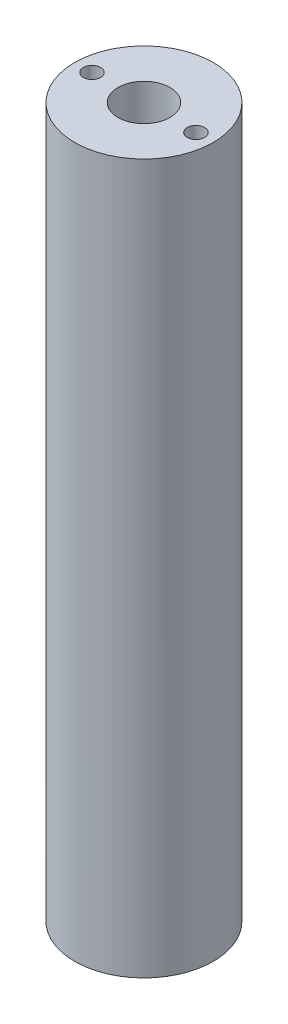
ISO-10303-21;
HEADER;
FILE_DESCRIPTION(('STEP AP214'),'2;1');
FILE_NAME('part.step','',(''),(''),'','','');
FILE_SCHEMA(('AUTOMOTIVE_DESIGN { 1 0 10303 214 1 1 1 1 }'));
ENDSEC;
DATA;
#1=APPLICATION_CONTEXT('core data for automotive mechanical design processes');
#2=APPLICATION_PROTOCOL_DEFINITION('international standard','automotive_design',2000,#1);
#3=PRODUCT_CONTEXT('',#1,'mechanical');
#4=PRODUCT('Part','Part','',(#3));
#5=PRODUCT_RELATED_PRODUCT_CATEGORY('part','',(#4));
#6=PRODUCT_DEFINITION_FORMATION('','',#4);
#7=PRODUCT_DEFINITION_CONTEXT('part definition',#1,'design');
#8=PRODUCT_DEFINITION('design','',#6,#7);
#9=PRODUCT_DEFINITION_SHAPE('','',#8);
#10=(LENGTH_UNIT() NAMED_UNIT(*) SI_UNIT(.MILLI.,.METRE.));
#11=(NAMED_UNIT(*) PLANE_ANGLE_UNIT() SI_UNIT($,.RADIAN.));
#12=(NAMED_UNIT(*) SI_UNIT($,.STERADIAN.) SOLID_ANGLE_UNIT());
#13=UNCERTAINTY_MEASURE_WITH_UNIT(LENGTH_MEASURE(1.E-05),#10,'distance_accuracy_value','');
#14=(GEOMETRIC_REPRESENTATION_CONTEXT(3) GLOBAL_UNCERTAINTY_ASSIGNED_CONTEXT((#13)) GLOBAL_UNIT_ASSIGNED_CONTEXT((#10,
#11,#12)) REPRESENTATION_CONTEXT('',''));
#15=CARTESIAN_POINT('',(0.,0.,0.));
#16=DIRECTION('',(0.,0.,1.));
#17=DIRECTION('',(1.,0.,0.));
#18=AXIS2_PLACEMENT_3D('',#15,#16,#17);
#19=CARTESIAN_POINT('',(101.306111270541,318.427183999586,0.));
#20=DIRECTION('',(0.,1.,0.));
#21=DIRECTION('',(-1.,0.,0.));
#22=AXIS2_PLACEMENT_3D('',#19,#20,#21);
#23=CYLINDRICAL_SURFACE('',#22,12.7);
#24=CARTESIAN_POINT('',(101.306111270541,188.458114983757,0.));
#25=DIRECTION('',(0.,-1.,0.));
#26=DIRECTION('',(0.,0.,-1.));
#27=AXIS2_PLACEMENT_3D('',#24,#25,#26);
#28=CIRCLE('',#27,12.7);
#29=CARTESIAN_POINT('',(101.306111270541,188.458114983757,-12.7));
#30=VERTEX_POINT('',#29);
#31=EDGE_CURVE('E42',#30,#30,#28,.F.);
#32=ORIENTED_EDGE('',*,*,#31,.F.);
#33=EDGE_LOOP('',(#32));
#34=FACE_BOUND('',#33,.T.);
#35=CARTESIAN_POINT('',(101.306111270541,58.4890459679269,0.));
#36=DIRECTION('',(0.,1.,0.));
#37=DIRECTION('',(-1.,0.,0.));
#38=AXIS2_PLACEMENT_3D('',#35,#36,#37);
#39=CIRCLE('',#38,12.7);
#40=CARTESIAN_POINT('',(88.6061112705412,58.4890459679269,0.));
#41=VERTEX_POINT('',#40);
#42=EDGE_CURVE('E10',#41,#41,#39,.T.);
#43=ORIENTED_EDGE('',*,*,#42,.T.);
#44=EDGE_LOOP('',(#43));
#45=FACE_BOUND('',#44,.T.);
#46=ADVANCED_FACE('F31',(#34,#45),#23,.T.);
#47=CARTESIAN_POINT('',(88.6061112705412,58.4890459679269,0.));
#48=DIRECTION('',(0.,-1.,0.));
#49=DIRECTION('',(1.,0.,0.));
#50=AXIS2_PLACEMENT_3D('',#47,#48,#49);
#51=PLANE('',#50);
#52=CARTESIAN_POINT('',(110.831111270541,58.4890459679269,0.));
#53=DIRECTION('',(0.,-1.,0.));
#54=DIRECTION('',(1.,0.,0.));
#55=AXIS2_PLACEMENT_3D('',#52,#53,#54);
#56=CIRCLE('',#55,1.5875);
#57=CARTESIAN_POINT('',(112.418611270541,58.4890459679269,0.));
#58=VERTEX_POINT('',#57);
#59=EDGE_CURVE('E66',#58,#58,#56,.T.);
#60=ORIENTED_EDGE('',*,*,#59,.F.);
#61=EDGE_LOOP('',(#60));
#62=FACE_BOUND('',#61,.T.);
#63=CARTESIAN_POINT('',(91.7811112705412,58.4890459679269,0.));
#64=DIRECTION('',(0.,-1.,0.));
#65=DIRECTION('',(1.,0.,0.));
#66=AXIS2_PLACEMENT_3D('',#63,#64,#65);
#67=CIRCLE('',#66,1.5875);
#68=CARTESIAN_POINT('',(93.3686112705413,58.4890459679269,0.));
#69=VERTEX_POINT('',#68);
#70=EDGE_CURVE('E60',#69,#69,#67,.T.);
#71=ORIENTED_EDGE('',*,*,#70,.F.);
#72=EDGE_LOOP('',(#71));
#73=FACE_BOUND('',#72,.T.);
#74=CARTESIAN_POINT('',(101.306111270541,58.4890459679269,0.));
#75=DIRECTION('',(0.,1.,0.));
#76=DIRECTION('',(-1.,0.,0.));
#77=AXIS2_PLACEMENT_3D('',#74,#75,#76);
#78=CIRCLE('',#77,4.7625);
#79=CARTESIAN_POINT('',(96.5436112705412,58.4890459679269,0.));
#80=VERTEX_POINT('',#79);
#81=EDGE_CURVE('E38',#80,#80,#78,.T.);
#82=ORIENTED_EDGE('',*,*,#81,.T.);
#83=EDGE_LOOP('',(#82));
#84=FACE_BOUND('',#83,.T.);
#85=ORIENTED_EDGE('',*,*,#42,.F.);
#86=EDGE_LOOP('',(#85));
#87=FACE_BOUND('',#86,.T.);
#88=ADVANCED_FACE('F81',(#62,#73,#84,#87),#51,.T.);
#89=CARTESIAN_POINT('',(101.306111270541,58.4890459679269,0.));
#90=DIRECTION('',(0.,1.,0.));
#91=DIRECTION('',(-1.,0.,0.));
#92=AXIS2_PLACEMENT_3D('',#89,#90,#91);
#93=CYLINDRICAL_SURFACE('',#92,4.7625);
#94=CARTESIAN_POINT('',(101.306111270541,188.458114983757,0.));
#95=DIRECTION('',(0.,-1.,0.));
#96=DIRECTION('',(0.,0.,-1.));
#97=AXIS2_PLACEMENT_3D('',#94,#95,#96);
#98=CIRCLE('',#97,4.7625);
#99=CARTESIAN_POINT('',(101.306111270541,188.458114983757,-4.7625));
#100=VERTEX_POINT('',#99);
#101=EDGE_CURVE('E34',#100,#100,#98,.F.);
#102=ORIENTED_EDGE('',*,*,#101,.T.);
#103=EDGE_LOOP('',(#102));
#104=FACE_BOUND('',#103,.T.);
#105=ORIENTED_EDGE('',*,*,#81,.F.);
#106=EDGE_LOOP('',(#105));
#107=FACE_BOUND('',#106,.T.);
#108=ADVANCED_FACE('F84',(#104,#107),#93,.F.);
#109=CARTESIAN_POINT('',(52.6227381384911,188.458114983757,-12.7));
#110=DIRECTION('',(0.,-1.,0.));
#111=DIRECTION('',(0.,0.,-1.));
#112=AXIS2_PLACEMENT_3D('',#109,#110,#111);
#113=PLANE('',#112);
#114=CARTESIAN_POINT('',(110.831111270541,188.458114983757,0.));
#115=DIRECTION('',(0.,1.,0.));
#116=DIRECTION('',(0.,0.,1.));
#117=AXIS2_PLACEMENT_3D('',#114,#115,#116);
#118=CIRCLE('',#117,1.5875);
#119=CARTESIAN_POINT('',(110.831111270541,188.458114983757,1.5875));
#120=VERTEX_POINT('',#119);
#121=EDGE_CURVE('E54',#120,#120,#118,.T.);
#122=ORIENTED_EDGE('',*,*,#121,.F.);
#123=EDGE_LOOP('',(#122));
#124=FACE_BOUND('',#123,.T.);
#125=CARTESIAN_POINT('',(91.7811112705412,188.458114983757,0.));
#126=DIRECTION('',(0.,1.,0.));
#127=DIRECTION('',(0.,0.,1.));
#128=AXIS2_PLACEMENT_3D('',#125,#126,#127);
#129=CIRCLE('',#128,1.5875);
#130=CARTESIAN_POINT('',(91.7811112705412,188.458114983757,1.5875));
#131=VERTEX_POINT('',#130);
#132=EDGE_CURVE('E47',#131,#131,#129,.T.);
#133=ORIENTED_EDGE('',*,*,#132,.F.);
#134=EDGE_LOOP('',(#133));
#135=FACE_BOUND('',#134,.T.);
#136=ORIENTED_EDGE('',*,*,#31,.T.);
#137=EDGE_LOOP('',(#136));
#138=FACE_BOUND('',#137,.T.);
#139=ORIENTED_EDGE('',*,*,#101,.F.);
#140=EDGE_LOOP('',(#139));
#141=FACE_BOUND('',#140,.T.);
#142=ADVANCED_FACE('F91',(#124,#135,#138,#141),#113,.F.);
#143=CARTESIAN_POINT('',(91.7811112705412,175.758114983757,0.));
#144=DIRECTION('',(0.,1.,0.));
#145=DIRECTION('',(0.,0.,1.));
#146=AXIS2_PLACEMENT_3D('',#143,#144,#145);
#147=CYLINDRICAL_SURFACE('',#146,1.5875);
#148=CARTESIAN_POINT('',(91.7811112705412,175.758114983757,0.));
#149=DIRECTION('',(0.,1.,0.));
#150=DIRECTION('',(0.,0.,1.));
#151=AXIS2_PLACEMENT_3D('',#148,#149,#150);
#152=CIRCLE('',#151,1.5875);
#153=CARTESIAN_POINT('',(91.7811112705412,175.758114983757,1.5875));
#154=VERTEX_POINT('',#153);
#155=EDGE_CURVE('E50',#154,#154,#152,.T.);
#156=ORIENTED_EDGE('',*,*,#155,.F.);
#157=EDGE_LOOP('',(#156));
#158=FACE_BOUND('',#157,.T.);
#159=ORIENTED_EDGE('',*,*,#132,.T.);
#160=EDGE_LOOP('',(#159));
#161=FACE_BOUND('',#160,.T.);
#162=ADVANCED_FACE('F99',(#158,#161),#147,.F.);
#163=CARTESIAN_POINT('',(91.7811112705412,175.758114983757,0.));
#164=DIRECTION('',(0.,1.,0.));
#165=DIRECTION('',(0.,0.,1.));
#166=AXIS2_PLACEMENT_3D('',#163,#164,#165);
#167=PLANE('',#166);
#168=ORIENTED_EDGE('',*,*,#155,.T.);
#169=EDGE_LOOP('',(#168));
#170=FACE_BOUND('',#169,.T.);
#171=ADVANCED_FACE('F133',(#170),#167,.T.);
#172=CARTESIAN_POINT('',(110.831111270541,175.758114983757,0.));
#173=DIRECTION('',(0.,1.,0.));
#174=DIRECTION('',(0.,0.,1.));
#175=AXIS2_PLACEMENT_3D('',#172,#173,#174);
#176=CYLINDRICAL_SURFACE('',#175,1.5875);
#177=CARTESIAN_POINT('',(110.831111270541,175.758114983757,0.));
#178=DIRECTION('',(0.,1.,0.));
#179=DIRECTION('',(0.,0.,1.));
#180=AXIS2_PLACEMENT_3D('',#177,#178,#179);
#181=CIRCLE('',#180,1.5875);
#182=CARTESIAN_POINT('',(110.831111270541,175.758114983757,1.5875));
#183=VERTEX_POINT('',#182);
#184=EDGE_CURVE('E51',#183,#183,#181,.T.);
#185=ORIENTED_EDGE('',*,*,#184,.F.);
#186=EDGE_LOOP('',(#185));
#187=FACE_BOUND('',#186,.T.);
#188=ORIENTED_EDGE('',*,*,#121,.T.);
#189=EDGE_LOOP('',(#188));
#190=FACE_BOUND('',#189,.T.);
#191=ADVANCED_FACE('F141',(#187,#190),#176,.F.);
#192=CARTESIAN_POINT('',(110.831111270541,175.758114983757,0.));
#193=DIRECTION('',(0.,1.,0.));
#194=DIRECTION('',(0.,0.,1.));
#195=AXIS2_PLACEMENT_3D('',#192,#193,#194);
#196=PLANE('',#195);
#197=ORIENTED_EDGE('',*,*,#184,.T.);
#198=EDGE_LOOP('',(#197));
#199=FACE_BOUND('',#198,.T.);
#200=ADVANCED_FACE('F149',(#199),#196,.T.);
#201=CARTESIAN_POINT('',(91.7811112705412,71.1890459679269,0.));
#202=DIRECTION('',(0.,-1.,0.));
#203=DIRECTION('',(1.,0.,0.));
#204=AXIS2_PLACEMENT_3D('',#201,#202,#203);
#205=CYLINDRICAL_SURFACE('',#204,1.5875);
#206=CARTESIAN_POINT('',(91.7811112705412,71.1890459679269,0.));
#207=DIRECTION('',(0.,-1.,0.));
#208=DIRECTION('',(1.,0.,0.));
#209=AXIS2_PLACEMENT_3D('',#206,#207,#208);
#210=CIRCLE('',#209,1.5875);
#211=CARTESIAN_POINT('',(93.3686112705413,71.1890459679269,0.));
#212=VERTEX_POINT('',#211);
#213=EDGE_CURVE('E57',#212,#212,#210,.T.);
#214=ORIENTED_EDGE('',*,*,#213,.F.);
#215=EDGE_LOOP('',(#214));
#216=FACE_BOUND('',#215,.T.);
#217=ORIENTED_EDGE('',*,*,#70,.T.);
#218=EDGE_LOOP('',(#217));
#219=FACE_BOUND('',#218,.T.);
#220=ADVANCED_FACE('F156',(#216,#219),#205,.F.);
#221=CARTESIAN_POINT('',(91.7811112705412,71.1890459679269,0.));
#222=DIRECTION('',(0.,-1.,0.));
#223=DIRECTION('',(1.,0.,0.));
#224=AXIS2_PLACEMENT_3D('',#221,#222,#223);
#225=PLANE('',#224);
#226=ORIENTED_EDGE('',*,*,#213,.T.);
#227=EDGE_LOOP('',(#226));
#228=FACE_BOUND('',#227,.T.);
#229=ADVANCED_FACE('F77',(#228),#225,.T.);
#230=CARTESIAN_POINT('',(110.831111270541,71.1890459679269,0.));
#231=DIRECTION('',(0.,-1.,0.));
#232=DIRECTION('',(1.,0.,0.));
#233=AXIS2_PLACEMENT_3D('',#230,#231,#232);
#234=CYLINDRICAL_SURFACE('',#233,1.5875);
#235=CARTESIAN_POINT('',(110.831111270541,71.1890459679269,0.));
#236=DIRECTION('',(0.,-1.,0.));
#237=DIRECTION('',(1.,0.,0.));
#238=AXIS2_PLACEMENT_3D('',#235,#236,#237);
#239=CIRCLE('',#238,1.5875);
#240=CARTESIAN_POINT('',(112.418611270541,71.1890459679269,0.));
#241=VERTEX_POINT('',#240);
#242=EDGE_CURVE('E63',#241,#241,#239,.T.);
#243=ORIENTED_EDGE('',*,*,#242,.F.);
#244=EDGE_LOOP('',(#243));
#245=FACE_BOUND('',#244,.T.);
#246=ORIENTED_EDGE('',*,*,#59,.T.);
#247=EDGE_LOOP('',(#246));
#248=FACE_BOUND('',#247,.T.);
#249=ADVANCED_FACE('F74',(#245,#248),#234,.F.);
#250=CARTESIAN_POINT('',(110.831111270541,71.1890459679269,0.));
#251=DIRECTION('',(0.,-1.,0.));
#252=DIRECTION('',(1.,0.,0.));
#253=AXIS2_PLACEMENT_3D('',#250,#251,#252);
#254=PLANE('',#253);
#255=ORIENTED_EDGE('',*,*,#242,.T.);
#256=EDGE_LOOP('',(#255));
#257=FACE_BOUND('',#256,.T.);
#258=ADVANCED_FACE('F72',(#257),#254,.T.);
#259=CLOSED_SHELL('',(#46,#88,#108,#142,#162,#171,#191,#200,#220,#229,#249,#258));
#260=MANIFOLD_SOLID_BREP('B2',#259);
#261=ADVANCED_BREP_SHAPE_REPRESENTATION('',(#18,#260),#14);
#262=SHAPE_DEFINITION_REPRESENTATION(#9,#261);
ENDSEC;
END-ISO-10303-21;
